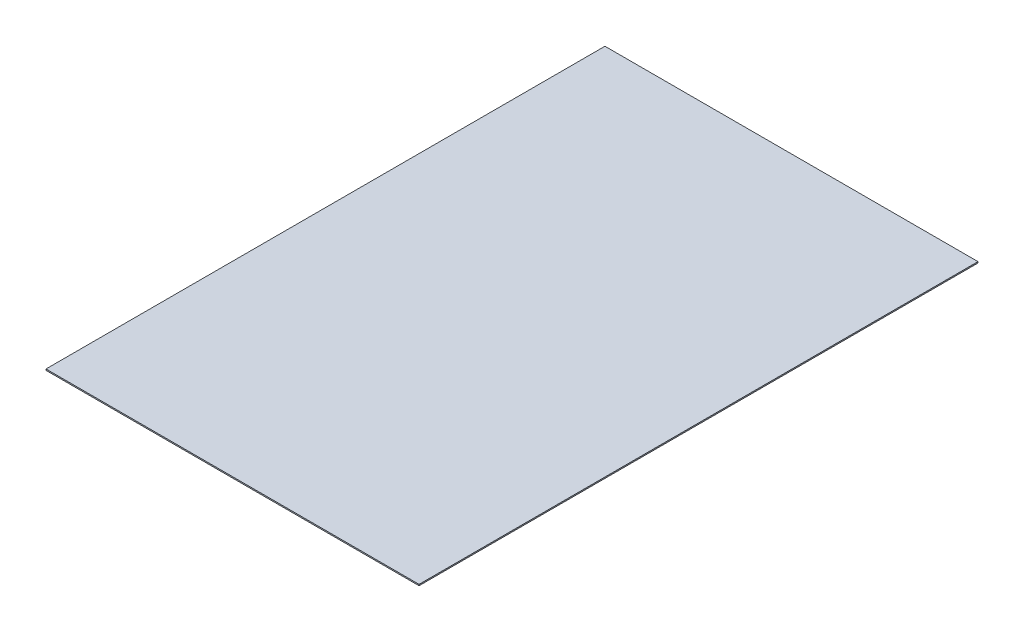
ISO-10303-21;
HEADER;
FILE_DESCRIPTION(('STEP AP214'),'2;1');
FILE_NAME('part.step','',(''),(''),'','','');
FILE_SCHEMA(('AUTOMOTIVE_DESIGN { 1 0 10303 214 1 1 1 1 }'));
ENDSEC;
DATA;
#1=APPLICATION_CONTEXT('core data for automotive mechanical design processes');
#2=APPLICATION_PROTOCOL_DEFINITION('international standard','automotive_design',2000,#1);
#3=PRODUCT_CONTEXT('',#1,'mechanical');
#4=PRODUCT('Part','Part','',(#3));
#5=PRODUCT_RELATED_PRODUCT_CATEGORY('part','',(#4));
#6=PRODUCT_DEFINITION_FORMATION('','',#4);
#7=PRODUCT_DEFINITION_CONTEXT('part definition',#1,'design');
#8=PRODUCT_DEFINITION('design','',#6,#7);
#9=PRODUCT_DEFINITION_SHAPE('','',#8);
#10=(LENGTH_UNIT() NAMED_UNIT(*) SI_UNIT(.MILLI.,.METRE.));
#11=(NAMED_UNIT(*) PLANE_ANGLE_UNIT() SI_UNIT($,.RADIAN.));
#12=(NAMED_UNIT(*) SI_UNIT($,.STERADIAN.) SOLID_ANGLE_UNIT());
#13=UNCERTAINTY_MEASURE_WITH_UNIT(LENGTH_MEASURE(1.E-05),#10,'distance_accuracy_value','');
#14=(GEOMETRIC_REPRESENTATION_CONTEXT(3) GLOBAL_UNCERTAINTY_ASSIGNED_CONTEXT((#13)) GLOBAL_UNIT_ASSIGNED_CONTEXT((#10,
#11,#12)) REPRESENTATION_CONTEXT('',''));
#15=CARTESIAN_POINT('',(0.,0.,0.));
#16=DIRECTION('',(0.,0.,1.));
#17=DIRECTION('',(1.,0.,0.));
#18=AXIS2_PLACEMENT_3D('',#15,#16,#17);
#19=CARTESIAN_POINT('',(76.2,0.254,0.));
#20=DIRECTION('',(-1.,0.,0.));
#21=DIRECTION('',(0.,0.,1.));
#22=AXIS2_PLACEMENT_3D('',#19,#20,#21);
#23=PLANE('',#22);
#24=DIRECTION('',(0.,0.,-1.));
#25=VECTOR('',#24,1.);
#26=CARTESIAN_POINT('',(76.2,0.,0.));
#27=LINE('',#26,#25);
#28=CARTESIAN_POINT('',(76.2,0.,0.));
#29=VERTEX_POINT('',#28);
#30=CARTESIAN_POINT('',(76.2,0.,-114.173));
#31=VERTEX_POINT('',#30);
#32=EDGE_CURVE('E96',#29,#31,#27,.T.);
#33=ORIENTED_EDGE('',*,*,#32,.T.);
#34=DIRECTION('',(0.,-1.,0.));
#35=VECTOR('',#34,1.);
#36=CARTESIAN_POINT('',(76.2,0.254,-114.173));
#37=LINE('',#36,#35);
#38=CARTESIAN_POINT('',(76.2,0.254,-114.173));
#39=VERTEX_POINT('',#38);
#40=EDGE_CURVE('E11',#39,#31,#37,.T.);
#41=ORIENTED_EDGE('',*,*,#40,.F.);
#42=DIRECTION('',(0.,0.,-1.));
#43=VECTOR('',#42,1.);
#44=CARTESIAN_POINT('',(76.2,0.254,0.));
#45=LINE('',#44,#43);
#46=CARTESIAN_POINT('',(76.2,0.254,0.));
#47=VERTEX_POINT('',#46);
#48=EDGE_CURVE('E84',#47,#39,#45,.T.);
#49=ORIENTED_EDGE('',*,*,#48,.F.);
#50=DIRECTION('',(0.,-1.,0.));
#51=VECTOR('',#50,1.);
#52=CARTESIAN_POINT('',(76.2,0.254,0.));
#53=LINE('',#52,#51);
#54=EDGE_CURVE('E92',#47,#29,#53,.T.);
#55=ORIENTED_EDGE('',*,*,#54,.T.);
#56=EDGE_LOOP('',(#33,#41,#49,#55));
#57=FACE_BOUND('',#56,.T.);
#58=ADVANCED_FACE('F33',(#57),#23,.F.);
#59=CARTESIAN_POINT('',(76.2,0.254,-114.173));
#60=DIRECTION('',(0.,0.,1.));
#61=DIRECTION('',(1.,0.,0.));
#62=AXIS2_PLACEMENT_3D('',#59,#60,#61);
#63=PLANE('',#62);
#64=DIRECTION('',(-1.,0.,0.));
#65=VECTOR('',#64,1.);
#66=CARTESIAN_POINT('',(76.2,0.,-114.173));
#67=LINE('',#66,#65);
#68=CARTESIAN_POINT('',(0.,0.,-114.173));
#69=VERTEX_POINT('',#68);
#70=EDGE_CURVE('E88',#31,#69,#67,.T.);
#71=ORIENTED_EDGE('',*,*,#70,.T.);
#72=DIRECTION('',(0.,-1.,0.));
#73=VECTOR('',#72,1.);
#74=CARTESIAN_POINT('',(0.,0.254,-114.173));
#75=LINE('',#74,#73);
#76=CARTESIAN_POINT('',(0.,0.254,-114.173));
#77=VERTEX_POINT('',#76);
#78=EDGE_CURVE('E41',#77,#69,#75,.T.);
#79=ORIENTED_EDGE('',*,*,#78,.F.);
#80=DIRECTION('',(-1.,0.,0.));
#81=VECTOR('',#80,1.);
#82=CARTESIAN_POINT('',(76.2,0.254,-114.173));
#83=LINE('',#82,#81);
#84=EDGE_CURVE('E79',#39,#77,#83,.T.);
#85=ORIENTED_EDGE('',*,*,#84,.F.);
#86=ORIENTED_EDGE('',*,*,#40,.T.);
#87=EDGE_LOOP('',(#71,#79,#85,#86));
#88=FACE_BOUND('',#87,.T.);
#89=ADVANCED_FACE('F87',(#88),#63,.F.);
#90=CARTESIAN_POINT('',(0.,0.254,0.));
#91=DIRECTION('',(1.,0.,0.));
#92=DIRECTION('',(0.,0.,-1.));
#93=AXIS2_PLACEMENT_3D('',#90,#91,#92);
#94=PLANE('',#93);
#95=DIRECTION('',(0.,0.,1.));
#96=VECTOR('',#95,1.);
#97=CARTESIAN_POINT('',(0.,0.,0.));
#98=LINE('',#97,#96);
#99=CARTESIAN_POINT('',(0.,0.,0.));
#100=VERTEX_POINT('',#99);
#101=EDGE_CURVE('E66',#69,#100,#98,.T.);
#102=ORIENTED_EDGE('',*,*,#101,.T.);
#103=DIRECTION('',(0.,-1.,0.));
#104=VECTOR('',#103,1.);
#105=CARTESIAN_POINT('',(0.,0.254,0.));
#106=LINE('',#105,#104);
#107=CARTESIAN_POINT('',(0.,0.254,0.));
#108=VERTEX_POINT('',#107);
#109=EDGE_CURVE('E89',#108,#100,#106,.T.);
#110=ORIENTED_EDGE('',*,*,#109,.F.);
#111=DIRECTION('',(0.,0.,1.));
#112=VECTOR('',#111,1.);
#113=CARTESIAN_POINT('',(0.,0.254,0.));
#114=LINE('',#113,#112);
#115=EDGE_CURVE('E82',#77,#108,#114,.T.);
#116=ORIENTED_EDGE('',*,*,#115,.F.);
#117=ORIENTED_EDGE('',*,*,#78,.T.);
#118=EDGE_LOOP('',(#102,#110,#116,#117));
#119=FACE_BOUND('',#118,.T.);
#120=ADVANCED_FACE('F90',(#119),#94,.F.);
#121=CARTESIAN_POINT('',(76.2,0.254,0.));
#122=DIRECTION('',(0.,0.,-1.));
#123=DIRECTION('',(-1.,0.,0.));
#124=AXIS2_PLACEMENT_3D('',#121,#122,#123);
#125=PLANE('',#124);
#126=DIRECTION('',(1.,0.,0.));
#127=VECTOR('',#126,1.);
#128=CARTESIAN_POINT('',(76.2,0.,0.));
#129=LINE('',#128,#127);
#130=EDGE_CURVE('E72',#100,#29,#129,.T.);
#131=ORIENTED_EDGE('',*,*,#130,.T.);
#132=ORIENTED_EDGE('',*,*,#54,.F.);
#133=DIRECTION('',(1.,0.,0.));
#134=VECTOR('',#133,1.);
#135=CARTESIAN_POINT('',(76.2,0.254,0.));
#136=LINE('',#135,#134);
#137=EDGE_CURVE('E49',#108,#47,#136,.T.);
#138=ORIENTED_EDGE('',*,*,#137,.F.);
#139=ORIENTED_EDGE('',*,*,#109,.T.);
#140=EDGE_LOOP('',(#131,#132,#138,#139));
#141=FACE_BOUND('',#140,.T.);
#142=ADVANCED_FACE('F103',(#141),#125,.F.);
#143=CARTESIAN_POINT('',(0.,0.254,0.));
#144=DIRECTION('',(0.,1.,0.));
#145=DIRECTION('',(0.,0.,1.));
#146=AXIS2_PLACEMENT_3D('',#143,#144,#145);
#147=PLANE('',#146);
#148=ORIENTED_EDGE('',*,*,#48,.T.);
#149=ORIENTED_EDGE('',*,*,#84,.T.);
#150=ORIENTED_EDGE('',*,*,#115,.T.);
#151=ORIENTED_EDGE('',*,*,#137,.T.);
#152=EDGE_LOOP('',(#148,#149,#150,#151));
#153=FACE_BOUND('',#152,.T.);
#154=ADVANCED_FACE('F80',(#153),#147,.T.);
#155=CARTESIAN_POINT('',(0.,0.,0.));
#156=DIRECTION('',(0.,1.,0.));
#157=DIRECTION('',(0.,0.,1.));
#158=AXIS2_PLACEMENT_3D('',#155,#156,#157);
#159=PLANE('',#158);
#160=ORIENTED_EDGE('',*,*,#32,.F.);
#161=ORIENTED_EDGE('',*,*,#130,.F.);
#162=ORIENTED_EDGE('',*,*,#101,.F.);
#163=ORIENTED_EDGE('',*,*,#70,.F.);
#164=EDGE_LOOP('',(#160,#161,#162,#163));
#165=FACE_BOUND('',#164,.T.);
#166=ADVANCED_FACE('F106',(#165),#159,.F.);
#167=CLOSED_SHELL('',(#58,#89,#120,#142,#154,#166));
#168=MANIFOLD_SOLID_BREP('B2',#167);
#169=ADVANCED_BREP_SHAPE_REPRESENTATION('',(#18,#168),#14);
#170=SHAPE_DEFINITION_REPRESENTATION(#9,#169);
ENDSEC;
END-ISO-10303-21;
